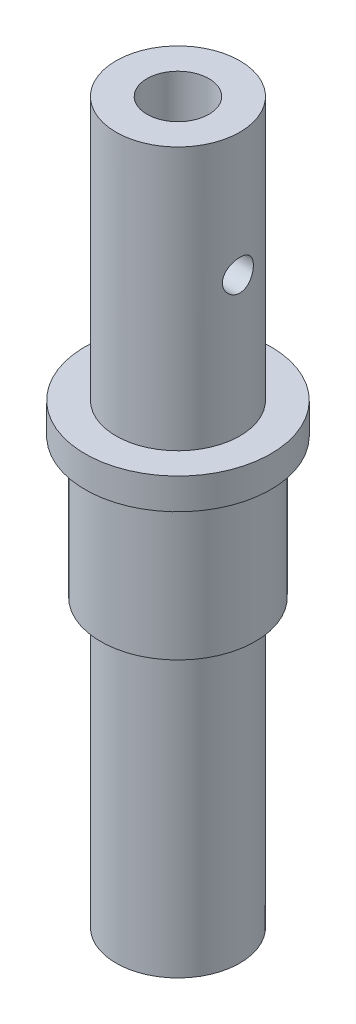
ISO-10303-21;
HEADER;
FILE_DESCRIPTION(('STEP AP214'),'2;1');
FILE_NAME('part.step','',(''),(''),'','','');
FILE_SCHEMA(('AUTOMOTIVE_DESIGN { 1 0 10303 214 1 1 1 1 }'));
ENDSEC;
DATA;
#1=APPLICATION_CONTEXT('core data for automotive mechanical design processes');
#2=APPLICATION_PROTOCOL_DEFINITION('international standard','automotive_design',2000,#1);
#3=PRODUCT_CONTEXT('',#1,'mechanical');
#4=PRODUCT('Part','Part','',(#3));
#5=PRODUCT_RELATED_PRODUCT_CATEGORY('part','',(#4));
#6=PRODUCT_DEFINITION_FORMATION('','',#4);
#7=PRODUCT_DEFINITION_CONTEXT('part definition',#1,'design');
#8=PRODUCT_DEFINITION('design','',#6,#7);
#9=PRODUCT_DEFINITION_SHAPE('','',#8);
#10=(LENGTH_UNIT() NAMED_UNIT(*) SI_UNIT(.MILLI.,.METRE.));
#11=(NAMED_UNIT(*) PLANE_ANGLE_UNIT() SI_UNIT($,.RADIAN.));
#12=(NAMED_UNIT(*) SI_UNIT($,.STERADIAN.) SOLID_ANGLE_UNIT());
#13=UNCERTAINTY_MEASURE_WITH_UNIT(LENGTH_MEASURE(1.E-05),#10,'distance_accuracy_value','');
#14=(GEOMETRIC_REPRESENTATION_CONTEXT(3) GLOBAL_UNCERTAINTY_ASSIGNED_CONTEXT((#13)) GLOBAL_UNIT_ASSIGNED_CONTEXT((#10,
#11,#12)) REPRESENTATION_CONTEXT('',''));
#15=CARTESIAN_POINT('',(0.,0.,0.));
#16=DIRECTION('',(0.,0.,1.));
#17=DIRECTION('',(1.,0.,0.));
#18=AXIS2_PLACEMENT_3D('',#15,#16,#17);
#19=CARTESIAN_POINT('',(0.,9.,0.));
#20=DIRECTION('',(0.,-1.,0.));
#21=DIRECTION('',(0.,0.,-1.));
#22=AXIS2_PLACEMENT_3D('',#19,#20,#21);
#23=CYLINDRICAL_SURFACE('',#22,4.);
#24=CARTESIAN_POINT('',(0.,9.,0.));
#25=DIRECTION('',(0.,1.,0.));
#26=DIRECTION('',(0.,0.,1.));
#27=AXIS2_PLACEMENT_3D('',#24,#25,#26);
#28=CIRCLE('',#27,4.);
#29=CARTESIAN_POINT('',(0.,9.,4.));
#30=VERTEX_POINT('',#29);
#31=EDGE_CURVE('E10',#30,#30,#28,.T.);
#32=ORIENTED_EDGE('',*,*,#31,.F.);
#33=EDGE_LOOP('',(#32));
#34=FACE_BOUND('',#33,.T.);
#35=CARTESIAN_POINT('',(0.,-8.,0.));
#36=DIRECTION('',(0.,-1.,0.));
#37=DIRECTION('',(0.,0.,-1.));
#38=AXIS2_PLACEMENT_3D('',#35,#36,#37);
#39=CIRCLE('',#38,4.);
#40=CARTESIAN_POINT('',(0.,-8.,-4.));
#41=VERTEX_POINT('',#40);
#42=EDGE_CURVE('E81',#41,#41,#39,.T.);
#43=ORIENTED_EDGE('',*,*,#42,.F.);
#44=EDGE_LOOP('',(#43));
#45=FACE_BOUND('',#44,.T.);
#46=CARTESIAN_POINT('',(-3.87298334620742,1.,1.));
#47=CARTESIAN_POINT('',(-3.87298440057185,1.05522030035679,0.999998431438699));
#48=CARTESIAN_POINT('',(-3.87417722499278,1.11045795943136,0.995410498208069));
#49=CARTESIAN_POINT('',(-3.87880744892249,1.21934703123261,0.977209250194446));
#50=CARTESIAN_POINT('',(-3.8822461547418,1.27299750177997,0.963590682698077));
#51=CARTESIAN_POINT('',(-3.89095489813012,1.37712141528784,0.927796479849635));
#52=CARTESIAN_POINT('',(-3.8962225706936,1.42759886215776,0.905631891140943));
#53=CARTESIAN_POINT('',(-3.90799276818327,1.52412434101248,0.853408456505407));
#54=CARTESIAN_POINT('',(-3.91449534553241,1.57017218483115,0.823349275424505));
#55=CARTESIAN_POINT('',(-3.92816286540368,1.65754465810584,0.755483370924517));
#56=CARTESIAN_POINT('',(-3.93533839048709,1.69875744014028,0.717534755081557));
#57=CARTESIAN_POINT('',(-3.94945150206622,1.77430455774388,0.635272825640328));
#58=CARTESIAN_POINT('',(-3.95638906626691,1.80863825024863,0.59095891767214));
#59=CARTESIAN_POINT('',(-3.96936166208095,1.86991018705258,0.496458080431565));
#60=CARTESIAN_POINT('',(-3.975382749602,1.8967385552646,0.446197830478044));
#61=CARTESIAN_POINT('',(-3.9857232477043,1.94152385766121,0.34170527371711));
#62=CARTESIAN_POINT('',(-3.99004290933747,1.9594821007662,0.287473554316778));
#63=CARTESIAN_POINT('',(-3.99641903539262,1.98565913383144,0.177743503501664));
#64=CARTESIAN_POINT('',(-3.99851957537723,1.99406785773063,0.12229308781959));
#65=CARTESIAN_POINT('',(-4.00037437642922,2.00150335171022,0.0107315277051085));
#66=CARTESIAN_POINT('',(-4.00012898438682,2.00053150888384,-0.0453795178152269));
#67=CARTESIAN_POINT('',(-3.99735237981413,1.98937005989994,-0.155352247172387));
#68=CARTESIAN_POINT('',(-3.99487200936349,1.97938546997846,-0.209236215601067));
#69=CARTESIAN_POINT('',(-3.98796334609942,1.9508114919806,-0.314538247413686));
#70=CARTESIAN_POINT('',(-3.98353494959376,1.93222164584904,-0.365956179370438));
#71=CARTESIAN_POINT('',(-3.97315003880358,1.88679897172517,-0.465406703501806));
#72=CARTESIAN_POINT('',(-3.96718007878021,1.8598931821353,-0.513404509766504));
#73=CARTESIAN_POINT('',(-3.9543596152386,1.7986577283535,-0.604275622340488));
#74=CARTESIAN_POINT('',(-3.94750895860996,1.76432677257575,-0.647148035085505));
#75=CARTESIAN_POINT('',(-3.93345485507808,1.68811650320705,-0.727774035084956));
#76=CARTESIAN_POINT('',(-3.92624687810367,1.64605804306089,-0.765357679075199));
#77=CARTESIAN_POINT('',(-3.91246017406683,1.5561600105839,-0.832976375963018));
#78=CARTESIAN_POINT('',(-3.90588147642388,1.5083201682036,-0.863011076046016));
#79=CARTESIAN_POINT('',(-3.89408198732659,1.40788398634041,-0.914788129022597));
#80=CARTESIAN_POINT('',(-3.88886793490288,1.35526570787472,-0.936489566970491));
#81=CARTESIAN_POINT('',(-3.88047456055983,1.24696581276942,-0.97068562063634));
#82=CARTESIAN_POINT('',(-3.87729480324087,1.19128485440675,-0.98318220655291));
#83=CARTESIAN_POINT('',(-3.87342142415656,1.08001619939075,-0.998331855466071));
#84=CARTESIAN_POINT('',(-3.87266435637459,1.02446488266815,-1.00123618956785));
#85=CARTESIAN_POINT('',(-3.87354937392416,0.913671225368737,-0.997806796206219));
#86=CARTESIAN_POINT('',(-3.87519123840506,0.858428856819504,-0.99147391913952));
#87=CARTESIAN_POINT('',(-3.88062832781824,0.750754294018118,-0.969970185575065));
#88=CARTESIAN_POINT('',(-3.8843878809375,0.698290909371663,-0.954945627312698));
#89=CARTESIAN_POINT('',(-3.89360287308385,0.596627416859327,-0.916647232668248));
#90=CARTESIAN_POINT('',(-3.89905851299445,0.547427696377865,-0.893372419085018));
#91=CARTESIAN_POINT('',(-3.91118454837305,0.452623488853061,-0.838708267174623));
#92=CARTESIAN_POINT('',(-3.91787667442657,0.407108463982759,-0.807168701534252));
#93=CARTESIAN_POINT('',(-3.93166833228686,0.321924654879459,-0.737060292934456));
#94=CARTESIAN_POINT('',(-3.93876793091388,0.282256833339971,-0.69849029480544));
#95=CARTESIAN_POINT('',(-3.95278961212643,0.208875582971618,-0.614262720984726));
#96=CARTESIAN_POINT('',(-3.95970280824734,0.175335974980476,-0.568451952531593));
#97=CARTESIAN_POINT('',(-3.97238886645494,0.116425653219503,-0.471702682694676));
#98=CARTESIAN_POINT('',(-3.97816178801584,0.0910545133567177,-0.420764448957592));
#99=CARTESIAN_POINT('',(-3.98788046295326,0.0494215861888277,-0.315558201731091));
#100=CARTESIAN_POINT('',(-3.99183932008964,0.0330942862483756,-0.261317381027882));
#101=CARTESIAN_POINT('',(-3.99754117358315,0.00981586615663329,-0.150749760318808));
#102=CARTESIAN_POINT('',(-3.99928459757363,0.00286293650437964,-0.094423365041244));
#103=CARTESIAN_POINT('',(-4.00034169408811,-0.00136758957553398,0.0170835264433261));
#104=CARTESIAN_POINT('',(-3.99971978880008,0.0010982909046098,0.072253826966033));
#105=CARTESIAN_POINT('',(-3.99625896457423,0.0150478272943316,0.181367496414739));
#106=CARTESIAN_POINT('',(-3.99342011157094,0.0265312150131025,0.235310901780886));
#107=CARTESIAN_POINT('',(-3.98585432853963,0.0580522197709269,0.340171035644816));
#108=CARTESIAN_POINT('',(-3.98113764502669,0.0780434533146239,0.391102494581018));
#109=CARTESIAN_POINT('',(-3.97031288913382,0.125970579019327,0.488917053041467));
#110=CARTESIAN_POINT('',(-3.96420464137727,0.153907472669569,0.53579964126505));
#111=CARTESIAN_POINT('',(-3.95107249681342,0.21771523399707,0.6254019284239));
#112=CARTESIAN_POINT('',(-3.94403016945646,0.253760142907367,0.667994988300587));
#113=CARTESIAN_POINT('',(-3.92990649053207,0.332422851973808,0.746615020271251));
#114=CARTESIAN_POINT('',(-3.92282512952424,0.375042316097944,0.782640325068177));
#115=CARTESIAN_POINT('',(-3.90927475860683,0.466601414201294,0.84776202647924));
#116=CARTESIAN_POINT('',(-3.90281963730391,0.515644123412482,0.876716619446593));
#117=CARTESIAN_POINT('',(-3.8914395555011,0.618055489922846,0.925926896615622));
#118=CARTESIAN_POINT('',(-3.88651348244814,0.671420966107285,0.946188909759556));
#119=CARTESIAN_POINT('',(-3.87951908741315,0.770577011826274,0.974422528565571));
#120=CARTESIAN_POINT('',(-3.87708663005761,0.815893164382358,0.983993170595829));
#121=CARTESIAN_POINT('',(-3.87381838580358,0.907468869001466,0.996782292572819));
#122=CARTESIAN_POINT('',(-3.87298246270639,0.953728340250628,1.00000131437052));
#123=CARTESIAN_POINT('',(-3.87298334620742,1.,1.));
#124=B_SPLINE_CURVE_WITH_KNOTS('',3,(#46,#47,#48,#49,#50,#51,#52,#53,#54,#55,#56,#57,#58,#59,
#60,#61,#62,#63,#64,#65,#66,#67,#68,#69,#70,#71,#72,#73,#74,#75,#76,#77,#78,#79,#80,#81,#82,#83,
#84,#85,#86,#87,#88,#89,#90,#91,#92,#93,#94,#95,#96,#97,#98,#99,#100,#101,#102,#103,#104,#105,
#106,#107,#108,#109,#110,#111,#112,#113,#114,#115,#116,#117,#118,#119,#120,#121,#122,#123),
.UNSPECIFIED.,.T.,.F.,(4,2,2,2,2,2,2,2,2,2,2,2,2,2,2,2,2,2,2,2,2,2,2,2,2,2,2,2,2,2,2,2,2,2,2,2,
2,2,4),(0.,0.16549097667523,0.331078296534211,0.496452290829153,0.661833306984658,
0.830495816734649,0.999174085882211,1.17020598555442,1.34121263935111,1.50875500394413,
1.67627259462683,1.84007305071853,2.00388222686189,2.16917149698052,2.3344895418384,
2.50428186625039,2.67408212476195,2.84470572799635,3.01529280048093,3.18137429900961,
3.34744050869795,3.51078961999957,3.67415808564841,3.84073138339937,4.00733207550292,
4.17810132382402,4.34886166284096,4.51836829119046,4.6878421955989,4.85273378447257,
5.01762046947067,5.18161950620159,5.34563922291503,5.51358838629103,5.68158012622478,
5.85270590910145,6.02370688542922,6.16239130867206,6.30106390036083),.UNSPECIFIED.);
#125=CARTESIAN_POINT('',(-3.87298334620742,1.,1.));
#126=VERTEX_POINT('',#125);
#127=EDGE_CURVE('E50',#126,#126,#124,.T.);
#128=ORIENTED_EDGE('',*,*,#127,.F.);
#129=EDGE_LOOP('',(#128));
#130=FACE_BOUND('',#129,.T.);
#131=CARTESIAN_POINT('',(3.87298334620742,1.,1.));
#132=CARTESIAN_POINT('',(3.87298440057185,0.944779699643215,0.999998431438699));
#133=CARTESIAN_POINT('',(3.87417722499278,0.88954204056864,0.995410498208069));
#134=CARTESIAN_POINT('',(3.87880744892249,0.780652968767387,0.977209250194446));
#135=CARTESIAN_POINT('',(3.8822461547418,0.727002498220035,0.963590682698077));
#136=CARTESIAN_POINT('',(3.89095489813012,0.622878584712162,0.927796479849635));
#137=CARTESIAN_POINT('',(3.8962225706936,0.572401137842241,0.905631891140943));
#138=CARTESIAN_POINT('',(3.90799276818327,0.475875658987524,0.853408456505407));
#139=CARTESIAN_POINT('',(3.91449534553241,0.429827815168853,0.823349275424505));
#140=CARTESIAN_POINT('',(3.92816286540368,0.342455341894155,0.755483370924517));
#141=CARTESIAN_POINT('',(3.93533839048709,0.301242559859724,0.717534755081557));
#142=CARTESIAN_POINT('',(3.94945150206622,0.225695442256121,0.635272825640328));
#143=CARTESIAN_POINT('',(3.95638906626691,0.191361749751371,0.59095891767214));
#144=CARTESIAN_POINT('',(3.96936166208095,0.130089812947419,0.496458080431565));
#145=CARTESIAN_POINT('',(3.975382749602,0.103261444735395,0.446197830478043));
#146=CARTESIAN_POINT('',(3.9857232477043,0.0584761423387856,0.34170527371711));
#147=CARTESIAN_POINT('',(3.99004290933747,0.0405178992337993,0.287473554316777));
#148=CARTESIAN_POINT('',(3.99641903539262,0.0143408661685612,0.177743503501663));
#149=CARTESIAN_POINT('',(3.99851957537723,0.00593214226936615,0.12229308781959));
#150=CARTESIAN_POINT('',(4.00037437642922,-0.00150335171021991,0.0107315277051079));
#151=CARTESIAN_POINT('',(4.00012898438682,-0.00053150888383951,-0.0453795178152274));
#152=CARTESIAN_POINT('',(3.99735237981413,0.0106299401000572,-0.155352247172387));
#153=CARTESIAN_POINT('',(3.99487200936349,0.0206145300215424,-0.209236215601067));
#154=CARTESIAN_POINT('',(3.98796334609942,0.0491885080193998,-0.314538247413686));
#155=CARTESIAN_POINT('',(3.98353494959376,0.0677783541509637,-0.365956179370438));
#156=CARTESIAN_POINT('',(3.97315003880358,0.113201028274826,-0.465406703501807));
#157=CARTESIAN_POINT('',(3.96718007878021,0.140106817864699,-0.513404509766504));
#158=CARTESIAN_POINT('',(3.9543596152386,0.201342271646503,-0.604275622340489));
#159=CARTESIAN_POINT('',(3.94750895860996,0.235673227424248,-0.647148035085505));
#160=CARTESIAN_POINT('',(3.93345485507808,0.31188349679295,-0.727774035084956));
#161=CARTESIAN_POINT('',(3.92624687810367,0.353941956939109,-0.765357679075199));
#162=CARTESIAN_POINT('',(3.91246017406683,0.443839989416101,-0.832976375963018));
#163=CARTESIAN_POINT('',(3.90588147642388,0.4916798317964,-0.863011076046016));
#164=CARTESIAN_POINT('',(3.89408198732659,0.592116013659586,-0.914788129022598));
#165=CARTESIAN_POINT('',(3.88886793490288,0.644734292125278,-0.936489566970491));
#166=CARTESIAN_POINT('',(3.88047456055983,0.753034187230581,-0.970685620636341));
#167=CARTESIAN_POINT('',(3.87729480324087,0.808715145593255,-0.98318220655291));
#168=CARTESIAN_POINT('',(3.87342142415656,0.919983800609248,-0.998331855466071));
#169=CARTESIAN_POINT('',(3.87266435637459,0.975535117331852,-1.00123618956785));
#170=CARTESIAN_POINT('',(3.87354937392416,1.08632877463126,-0.997806796206219));
#171=CARTESIAN_POINT('',(3.87519123840506,1.1415711431805,-0.99147391913952));
#172=CARTESIAN_POINT('',(3.88062832781824,1.24924570598188,-0.969970185575065));
#173=CARTESIAN_POINT('',(3.8843878809375,1.30170909062834,-0.954945627312698));
#174=CARTESIAN_POINT('',(3.89360287308385,1.40337258314067,-0.916647232668248));
#175=CARTESIAN_POINT('',(3.89905851299445,1.45257230362214,-0.893372419085018));
#176=CARTESIAN_POINT('',(3.91118454837305,1.54737651114694,-0.838708267174623));
#177=CARTESIAN_POINT('',(3.91787667442657,1.59289153601724,-0.807168701534251));
#178=CARTESIAN_POINT('',(3.93166833228686,1.67807534512054,-0.737060292934456));
#179=CARTESIAN_POINT('',(3.93876793091388,1.71774316666003,-0.698490294805439));
#180=CARTESIAN_POINT('',(3.95278961212643,1.79112441702838,-0.614262720984726));
#181=CARTESIAN_POINT('',(3.95970280824734,1.82466402501952,-0.568451952531593));
#182=CARTESIAN_POINT('',(3.97238886645494,1.8835743467805,-0.471702682694675));
#183=CARTESIAN_POINT('',(3.97816178801584,1.90894548664328,-0.420764448957591));
#184=CARTESIAN_POINT('',(3.98788046295326,1.95057841381117,-0.31555820173109));
#185=CARTESIAN_POINT('',(3.99183932008964,1.96690571375162,-0.261317381027881));
#186=CARTESIAN_POINT('',(3.99754117358315,1.99018413384337,-0.150749760318808));
#187=CARTESIAN_POINT('',(3.99928459757363,1.99713706349562,-0.0944233650412434));
#188=CARTESIAN_POINT('',(4.00034169408811,2.00136758957553,0.0170835264433266));
#189=CARTESIAN_POINT('',(3.99971978880008,1.99890170909539,0.0722538269660335));
#190=CARTESIAN_POINT('',(3.99625896457423,1.98495217270567,0.18136749641474));
#191=CARTESIAN_POINT('',(3.99342011157094,1.9734687849869,0.235310901780887));
#192=CARTESIAN_POINT('',(3.98585432853963,1.94194778022907,0.340171035644816));
#193=CARTESIAN_POINT('',(3.98113764502669,1.92195654668538,0.391102494581019));
#194=CARTESIAN_POINT('',(3.97031288913382,1.87402942098067,0.488917053041468));
#195=CARTESIAN_POINT('',(3.96420464137727,1.84609252733043,0.535799641265051));
#196=CARTESIAN_POINT('',(3.95107249681342,1.78228476600293,0.6254019284239));
#197=CARTESIAN_POINT('',(3.94403016945647,1.74623985709263,0.667994988300587));
#198=CARTESIAN_POINT('',(3.92990649053207,1.66757714802619,0.746615020271251));
#199=CARTESIAN_POINT('',(3.92282512952424,1.62495768390206,0.782640325068178));
#200=CARTESIAN_POINT('',(3.90927475860683,1.53339858579871,0.84776202647924));
#201=CARTESIAN_POINT('',(3.90281963730391,1.48435587658752,0.876716619446593));
#202=CARTESIAN_POINT('',(3.8914395555011,1.38194451007715,0.925926896615622));
#203=CARTESIAN_POINT('',(3.88651348244814,1.32857903389271,0.946188909759557));
#204=CARTESIAN_POINT('',(3.87951908741315,1.22942298817373,0.974422528565571));
#205=CARTESIAN_POINT('',(3.87708663005761,1.18410683561764,0.983993170595829));
#206=CARTESIAN_POINT('',(3.87381838580358,1.09253113099853,0.996782292572819));
#207=CARTESIAN_POINT('',(3.87298246270639,1.04627165974937,1.00000131437052));
#208=CARTESIAN_POINT('',(3.87298334620742,1.,1.));
#209=B_SPLINE_CURVE_WITH_KNOTS('',3,(#131,#132,#133,#134,#135,#136,#137,#138,#139,#140,#141,
#142,#143,#144,#145,#146,#147,#148,#149,#150,#151,#152,#153,#154,#155,#156,#157,#158,#159,#160,
#161,#162,#163,#164,#165,#166,#167,#168,#169,#170,#171,#172,#173,#174,#175,#176,#177,#178,#179,
#180,#181,#182,#183,#184,#185,#186,#187,#188,#189,#190,#191,#192,#193,#194,#195,#196,#197,#198,
#199,#200,#201,#202,#203,#204,#205,#206,#207,#208),.UNSPECIFIED.,.T.,.F.,(4,2,2,2,2,2,2,2,2,2,2,
2,2,2,2,2,2,2,2,2,2,2,2,2,2,2,2,2,2,2,2,2,2,2,2,2,2,2,4),(0.,0.16549097667523,0.331078296534211,
0.496452290829153,0.661833306984659,0.830495816734649,0.999174085882211,1.17020598555442,
1.34121263935111,1.50875500394413,1.67627259462683,1.84007305071853,2.00388222686189,
2.16917149698052,2.3344895418384,2.50428186625039,2.67408212476195,2.84470572799635,
3.01529280048093,3.18137429900961,3.34744050869795,3.51078961999957,3.67415808564841,
3.84073138339937,4.00733207550292,4.17810132382402,4.34886166284096,4.51836829119046,
4.6878421955989,4.85273378447257,5.01762046947067,5.18161950620159,5.34563922291503,
5.51358838629103,5.68158012622478,5.85270590910145,6.02370688542922,6.16239130867206,
6.30106390036083),.UNSPECIFIED.);
#210=CARTESIAN_POINT('',(3.87298334620742,1.,1.));
#211=VERTEX_POINT('',#210);
#212=EDGE_CURVE('E35',#211,#211,#209,.T.);
#213=ORIENTED_EDGE('',*,*,#212,.F.);
#214=EDGE_LOOP('',(#213));
#215=FACE_BOUND('',#214,.T.);
#216=ADVANCED_FACE('F31',(#34,#45,#130,#215),#23,.T.);
#217=CARTESIAN_POINT('',(0.,9.,0.));
#218=DIRECTION('',(0.,1.,0.));
#219=DIRECTION('',(0.,0.,1.));
#220=AXIS2_PLACEMENT_3D('',#217,#218,#219);
#221=PLANE('',#220);
#222=CARTESIAN_POINT('',(0.,9.,0.));
#223=DIRECTION('',(0.,1.,0.));
#224=DIRECTION('',(0.,0.,1.));
#225=AXIS2_PLACEMENT_3D('',#222,#223,#224);
#226=CIRCLE('',#225,2.);
#227=CARTESIAN_POINT('',(0.,9.,2.));
#228=VERTEX_POINT('',#227);
#229=EDGE_CURVE('E47',#228,#228,#226,.T.);
#230=ORIENTED_EDGE('',*,*,#229,.F.);
#231=EDGE_LOOP('',(#230));
#232=FACE_BOUND('',#231,.T.);
#233=ORIENTED_EDGE('',*,*,#31,.T.);
#234=EDGE_LOOP('',(#233));
#235=FACE_BOUND('',#234,.T.);
#236=ADVANCED_FACE('F70',(#232,#235),#221,.T.);
#237=CARTESIAN_POINT('',(0.,4.,0.));
#238=DIRECTION('',(0.,1.,0.));
#239=DIRECTION('',(0.,0.,1.));
#240=AXIS2_PLACEMENT_3D('',#237,#238,#239);
#241=CYLINDRICAL_SURFACE('',#240,2.);
#242=CARTESIAN_POINT('',(0.,4.,0.));
#243=DIRECTION('',(0.,1.,0.));
#244=DIRECTION('',(0.,0.,1.));
#245=AXIS2_PLACEMENT_3D('',#242,#243,#244);
#246=CIRCLE('',#245,2.);
#247=CARTESIAN_POINT('',(0.,4.,2.));
#248=VERTEX_POINT('',#247);
#249=EDGE_CURVE('E42',#248,#248,#246,.T.);
#250=ORIENTED_EDGE('',*,*,#249,.F.);
#251=EDGE_LOOP('',(#250));
#252=FACE_BOUND('',#251,.T.);
#253=ORIENTED_EDGE('',*,*,#229,.T.);
#254=EDGE_LOOP('',(#253));
#255=FACE_BOUND('',#254,.T.);
#256=ADVANCED_FACE('F67',(#252,#255),#241,.F.);
#257=CARTESIAN_POINT('',(0.,4.,0.));
#258=DIRECTION('',(0.,1.,0.));
#259=DIRECTION('',(0.,0.,1.));
#260=AXIS2_PLACEMENT_3D('',#257,#258,#259);
#261=PLANE('',#260);
#262=ORIENTED_EDGE('',*,*,#249,.T.);
#263=EDGE_LOOP('',(#262));
#264=FACE_BOUND('',#263,.T.);
#265=ADVANCED_FACE('F61',(#264),#261,.T.);
#266=CARTESIAN_POINT('',(10.,1.,0.));
#267=DIRECTION('',(-1.,0.,0.));
#268=DIRECTION('',(0.,0.,1.));
#269=AXIS2_PLACEMENT_3D('',#266,#267,#268);
#270=CYLINDRICAL_SURFACE('',#269,1.);
#271=ORIENTED_EDGE('',*,*,#127,.T.);
#272=EDGE_LOOP('',(#271));
#273=FACE_BOUND('',#272,.T.);
#274=ORIENTED_EDGE('',*,*,#212,.T.);
#275=EDGE_LOOP('',(#274));
#276=FACE_BOUND('',#275,.T.);
#277=ADVANCED_FACE('F55',(#273,#276),#270,.F.);
#278=CARTESIAN_POINT('',(0.,-10.,0.));
#279=DIRECTION('',(0.,1.,0.));
#280=DIRECTION('',(0.,0.,1.));
#281=AXIS2_PLACEMENT_3D('',#278,#279,#280);
#282=CYLINDRICAL_SURFACE('',#281,6.);
#283=CARTESIAN_POINT('',(0.,-10.,0.));
#284=DIRECTION('',(0.,-1.,0.));
#285=DIRECTION('',(0.,0.,-1.));
#286=AXIS2_PLACEMENT_3D('',#283,#284,#285);
#287=CIRCLE('',#286,6.);
#288=CARTESIAN_POINT('',(0.,-10.,-6.));
#289=VERTEX_POINT('',#288);
#290=EDGE_CURVE('E54',#289,#289,#287,.T.);
#291=ORIENTED_EDGE('',*,*,#290,.F.);
#292=EDGE_LOOP('',(#291));
#293=FACE_BOUND('',#292,.T.);
#294=CARTESIAN_POINT('',(0.,-8.,0.));
#295=DIRECTION('',(0.,-1.,0.));
#296=DIRECTION('',(0.,0.,-1.));
#297=AXIS2_PLACEMENT_3D('',#294,#295,#296);
#298=CIRCLE('',#297,6.);
#299=CARTESIAN_POINT('',(0.,-8.,-6.));
#300=VERTEX_POINT('',#299);
#301=EDGE_CURVE('E88',#300,#300,#298,.T.);
#302=ORIENTED_EDGE('',*,*,#301,.T.);
#303=EDGE_LOOP('',(#302));
#304=FACE_BOUND('',#303,.T.);
#305=ADVANCED_FACE('F60',(#293,#304),#282,.T.);
#306=CARTESIAN_POINT('',(0.,-10.,0.));
#307=DIRECTION('',(0.,-1.,0.));
#308=DIRECTION('',(0.,0.,-1.));
#309=AXIS2_PLACEMENT_3D('',#306,#307,#308);
#310=PLANE('',#309);
#311=CARTESIAN_POINT('',(0.,-10.,0.));
#312=DIRECTION('',(0.,-1.,0.));
#313=DIRECTION('',(0.,0.,-1.));
#314=AXIS2_PLACEMENT_3D('',#311,#312,#313);
#315=CIRCLE('',#314,5.);
#316=CARTESIAN_POINT('',(0.,-10.,-5.));
#317=VERTEX_POINT('',#316);
#318=EDGE_CURVE('E94',#317,#317,#315,.T.);
#319=ORIENTED_EDGE('',*,*,#318,.F.);
#320=EDGE_LOOP('',(#319));
#321=FACE_BOUND('',#320,.T.);
#322=ORIENTED_EDGE('',*,*,#290,.T.);
#323=EDGE_LOOP('',(#322));
#324=FACE_BOUND('',#323,.T.);
#325=ADVANCED_FACE('F127',(#321,#324),#310,.T.);
#326=CARTESIAN_POINT('',(0.,-8.,0.));
#327=DIRECTION('',(0.,-1.,0.));
#328=DIRECTION('',(0.,0.,-1.));
#329=AXIS2_PLACEMENT_3D('',#326,#327,#328);
#330=PLANE('',#329);
#331=ORIENTED_EDGE('',*,*,#42,.T.);
#332=EDGE_LOOP('',(#331));
#333=FACE_BOUND('',#332,.T.);
#334=ORIENTED_EDGE('',*,*,#301,.F.);
#335=EDGE_LOOP('',(#334));
#336=FACE_BOUND('',#335,.T.);
#337=ADVANCED_FACE('F123',(#333,#336),#330,.F.);
#338=CARTESIAN_POINT('',(0.,-19.,0.));
#339=DIRECTION('',(0.,1.,0.));
#340=DIRECTION('',(0.,0.,1.));
#341=AXIS2_PLACEMENT_3D('',#338,#339,#340);
#342=CYLINDRICAL_SURFACE('',#341,5.);
#343=CARTESIAN_POINT('',(0.,-19.,0.));
#344=DIRECTION('',(0.,-1.,0.));
#345=DIRECTION('',(0.,0.,-1.));
#346=AXIS2_PLACEMENT_3D('',#343,#344,#345);
#347=CIRCLE('',#346,5.);
#348=CARTESIAN_POINT('',(0.,-19.,-5.));
#349=VERTEX_POINT('',#348);
#350=EDGE_CURVE('E91',#349,#349,#347,.T.);
#351=ORIENTED_EDGE('',*,*,#350,.F.);
#352=EDGE_LOOP('',(#351));
#353=FACE_BOUND('',#352,.T.);
#354=ORIENTED_EDGE('',*,*,#318,.T.);
#355=EDGE_LOOP('',(#354));
#356=FACE_BOUND('',#355,.T.);
#357=ADVANCED_FACE('F117',(#353,#356),#342,.T.);
#358=CARTESIAN_POINT('',(0.,-19.,0.));
#359=DIRECTION('',(0.,-1.,0.));
#360=DIRECTION('',(0.,0.,-1.));
#361=AXIS2_PLACEMENT_3D('',#358,#359,#360);
#362=PLANE('',#361);
#363=CARTESIAN_POINT('',(0.,-19.,0.));
#364=DIRECTION('',(0.,-1.,0.));
#365=DIRECTION('',(0.,0.,-1.));
#366=AXIS2_PLACEMENT_3D('',#363,#364,#365);
#367=CIRCLE('',#366,4.);
#368=CARTESIAN_POINT('',(0.,-19.,-4.));
#369=VERTEX_POINT('',#368);
#370=EDGE_CURVE('E100',#369,#369,#367,.T.);
#371=ORIENTED_EDGE('',*,*,#370,.F.);
#372=EDGE_LOOP('',(#371));
#373=FACE_BOUND('',#372,.T.);
#374=ORIENTED_EDGE('',*,*,#350,.T.);
#375=EDGE_LOOP('',(#374));
#376=FACE_BOUND('',#375,.T.);
#377=ADVANCED_FACE('F111',(#373,#376),#362,.T.);
#378=CARTESIAN_POINT('',(0.,-37.5,0.));
#379=DIRECTION('',(0.,1.,0.));
#380=DIRECTION('',(0.,0.,1.));
#381=AXIS2_PLACEMENT_3D('',#378,#379,#380);
#382=CYLINDRICAL_SURFACE('',#381,4.);
#383=CARTESIAN_POINT('',(0.,-37.5,0.));
#384=DIRECTION('',(0.,-1.,0.));
#385=DIRECTION('',(0.,0.,-1.));
#386=AXIS2_PLACEMENT_3D('',#383,#384,#385);
#387=CIRCLE('',#386,4.);
#388=CARTESIAN_POINT('',(0.,-37.5,-4.));
#389=VERTEX_POINT('',#388);
#390=EDGE_CURVE('E97',#389,#389,#387,.T.);
#391=ORIENTED_EDGE('',*,*,#390,.F.);
#392=EDGE_LOOP('',(#391));
#393=FACE_BOUND('',#392,.T.);
#394=ORIENTED_EDGE('',*,*,#370,.T.);
#395=EDGE_LOOP('',(#394));
#396=FACE_BOUND('',#395,.T.);
#397=ADVANCED_FACE('F108',(#393,#396),#382,.T.);
#398=CARTESIAN_POINT('',(0.,-37.5,0.));
#399=DIRECTION('',(0.,-1.,0.));
#400=DIRECTION('',(0.,0.,-1.));
#401=AXIS2_PLACEMENT_3D('',#398,#399,#400);
#402=PLANE('',#401);
#403=ORIENTED_EDGE('',*,*,#390,.T.);
#404=EDGE_LOOP('',(#403));
#405=FACE_BOUND('',#404,.T.);
#406=ADVANCED_FACE('F106',(#405),#402,.T.);
#407=CLOSED_SHELL('',(#216,#236,#256,#265,#277,#305,#325,#337,#357,#377,#397,#406));
#408=MANIFOLD_SOLID_BREP('B2',#407);
#409=ADVANCED_BREP_SHAPE_REPRESENTATION('',(#18,#408),#14);
#410=SHAPE_DEFINITION_REPRESENTATION(#9,#409);
ENDSEC;
END-ISO-10303-21;
